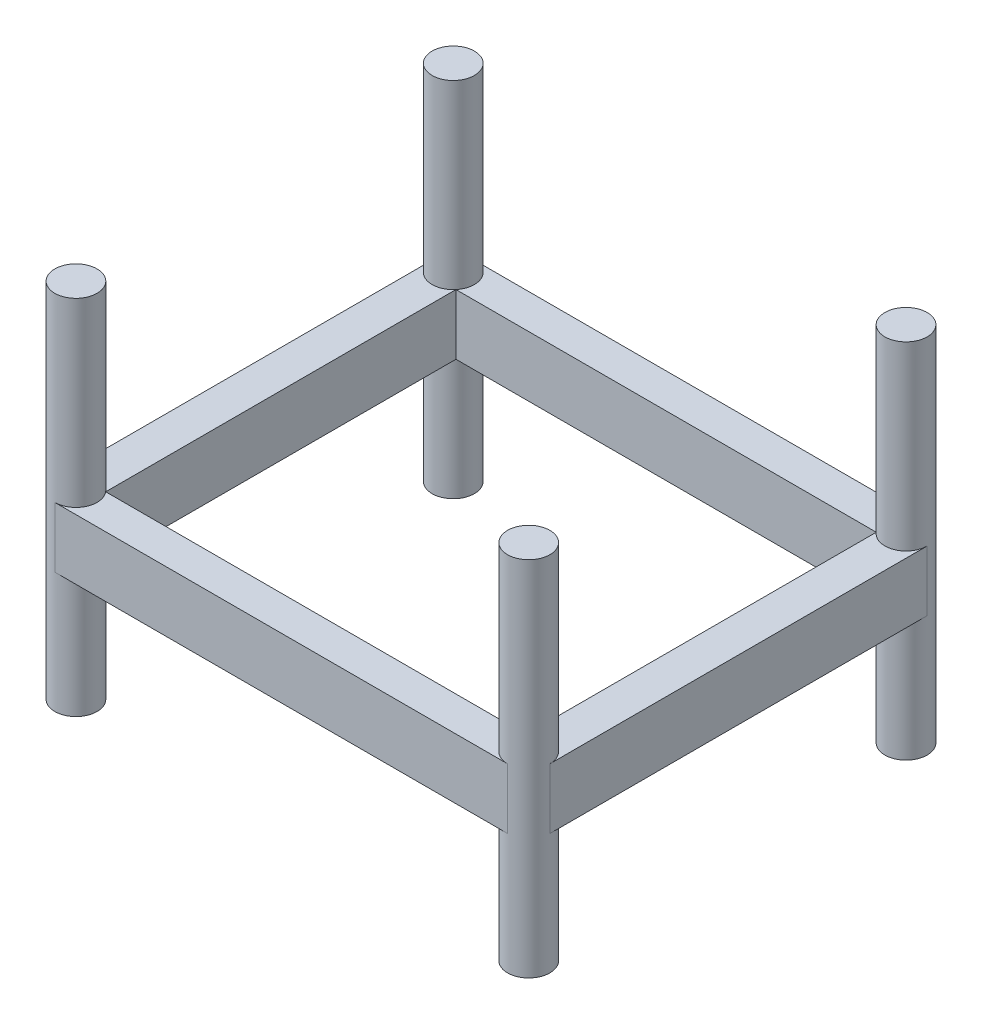
ISO-10303-21;
HEADER;
FILE_DESCRIPTION(('STEP AP214'),'2;1');
FILE_NAME('part.step','',(''),(''),'','','');
FILE_SCHEMA(('AUTOMOTIVE_DESIGN { 1 0 10303 214 1 1 1 1 }'));
ENDSEC;
DATA;
#1=APPLICATION_CONTEXT('core data for automotive mechanical design processes');
#2=APPLICATION_PROTOCOL_DEFINITION('international standard','automotive_design',2000,#1);
#3=PRODUCT_CONTEXT('',#1,'mechanical');
#4=PRODUCT('Part','Part','',(#3));
#5=PRODUCT_RELATED_PRODUCT_CATEGORY('part','',(#4));
#6=PRODUCT_DEFINITION_FORMATION('','',#4);
#7=PRODUCT_DEFINITION_CONTEXT('part definition',#1,'design');
#8=PRODUCT_DEFINITION('design','',#6,#7);
#9=PRODUCT_DEFINITION_SHAPE('','',#8);
#10=(LENGTH_UNIT() NAMED_UNIT(*) SI_UNIT(.MILLI.,.METRE.));
#11=(NAMED_UNIT(*) PLANE_ANGLE_UNIT() SI_UNIT($,.RADIAN.));
#12=(NAMED_UNIT(*) SI_UNIT($,.STERADIAN.) SOLID_ANGLE_UNIT());
#13=UNCERTAINTY_MEASURE_WITH_UNIT(LENGTH_MEASURE(1.E-05),#10,'distance_accuracy_value','');
#14=(GEOMETRIC_REPRESENTATION_CONTEXT(3) GLOBAL_UNCERTAINTY_ASSIGNED_CONTEXT((#13)) GLOBAL_UNIT_ASSIGNED_CONTEXT((#10,
#11,#12)) REPRESENTATION_CONTEXT('',''));
#15=CARTESIAN_POINT('',(0.,0.,0.));
#16=DIRECTION('',(0.,0.,1.));
#17=DIRECTION('',(1.,0.,0.));
#18=AXIS2_PLACEMENT_3D('',#15,#16,#17);
#19=CARTESIAN_POINT('',(-19.05,5.08,15.875));
#20=DIRECTION('',(0.,1.,0.));
#21=DIRECTION('',(0.,0.,1.));
#22=AXIS2_PLACEMENT_3D('',#19,#20,#21);
#23=PLANE('',#22);
#24=CARTESIAN_POINT('',(-19.05,5.08,-15.875));
#25=DIRECTION('',(0.,1.,0.));
#26=DIRECTION('',(0.,0.,1.));
#27=AXIS2_PLACEMENT_3D('',#24,#25,#26);
#28=CIRCLE('',#27,1.778);
#29=CARTESIAN_POINT('',(-17.6841025648759,5.08,-14.7367521373966));
#30=VERTEX_POINT('',#29);
#31=CARTESIAN_POINT('',(-19.05,5.08,-17.653));
#32=VERTEX_POINT('',#31);
#33=EDGE_CURVE('E105',#30,#32,#28,.T.);
#34=ORIENTED_EDGE('',*,*,#33,.F.);
#35=DIRECTION('',(-1.,0.,0.));
#36=VECTOR('',#35,1.);
#37=CARTESIAN_POINT('',(-17.6841025648759,5.08,-14.7367521373966));
#38=LINE('',#37,#36);
#39=CARTESIAN_POINT('',(17.6841025648759,5.08,-14.7367521373966));
#40=VERTEX_POINT('',#39);
#41=EDGE_CURVE('E191',#40,#30,#38,.T.);
#42=ORIENTED_EDGE('',*,*,#41,.F.);
#43=CARTESIAN_POINT('',(19.05,5.08,-15.875));
#44=DIRECTION('',(0.,1.,0.));
#45=DIRECTION('',(0.,0.,1.));
#46=AXIS2_PLACEMENT_3D('',#43,#44,#45);
#47=CIRCLE('',#46,1.778);
#48=CARTESIAN_POINT('',(19.05,5.08,-17.653));
#49=VERTEX_POINT('',#48);
#50=EDGE_CURVE('E108',#49,#40,#47,.T.);
#51=ORIENTED_EDGE('',*,*,#50,.F.);
#52=DIRECTION('',(-1.,0.,0.));
#53=VECTOR('',#52,1.);
#54=CARTESIAN_POINT('',(-19.05,5.08,-17.653));
#55=LINE('',#54,#53);
#56=EDGE_CURVE('E100',#49,#32,#55,.T.);
#57=ORIENTED_EDGE('',*,*,#56,.T.);
#58=EDGE_LOOP('',(#34,#42,#51,#57));
#59=FACE_BOUND('',#58,.T.);
#60=ADVANCED_FACE('F39',(#59),#23,.T.);
#61=CARTESIAN_POINT('',(-19.05,0.,15.875));
#62=DIRECTION('',(0.,1.,0.));
#63=DIRECTION('',(0.,0.,1.));
#64=AXIS2_PLACEMENT_3D('',#61,#62,#63);
#65=PLANE('',#64);
#66=DIRECTION('',(-1.,0.,0.));
#67=VECTOR('',#66,1.);
#68=CARTESIAN_POINT('',(-17.6841025648759,0.,-14.7367521373966));
#69=LINE('',#68,#67);
#70=CARTESIAN_POINT('',(17.6841025648759,0.,-14.7367521373966));
#71=VERTEX_POINT('',#70);
#72=CARTESIAN_POINT('',(-17.6841025648759,0.,-14.7367521373966));
#73=VERTEX_POINT('',#72);
#74=EDGE_CURVE('E208',#71,#73,#69,.T.);
#75=ORIENTED_EDGE('',*,*,#74,.T.);
#76=CARTESIAN_POINT('',(-19.05,0.,-15.875));
#77=DIRECTION('',(0.,1.,0.));
#78=DIRECTION('',(0.,0.,1.));
#79=AXIS2_PLACEMENT_3D('',#76,#77,#78);
#80=CIRCLE('',#79,1.778);
#81=CARTESIAN_POINT('',(-19.05,0.,-17.653));
#82=VERTEX_POINT('',#81);
#83=EDGE_CURVE('E140',#73,#82,#80,.T.);
#84=ORIENTED_EDGE('',*,*,#83,.T.);
#85=DIRECTION('',(-1.,0.,0.));
#86=VECTOR('',#85,1.);
#87=CARTESIAN_POINT('',(-19.05,0.,-17.653));
#88=LINE('',#87,#86);
#89=CARTESIAN_POINT('',(19.05,0.,-17.653));
#90=VERTEX_POINT('',#89);
#91=EDGE_CURVE('E121',#90,#82,#88,.T.);
#92=ORIENTED_EDGE('',*,*,#91,.F.);
#93=CARTESIAN_POINT('',(19.05,0.,-15.875));
#94=DIRECTION('',(0.,1.,0.));
#95=DIRECTION('',(0.,0.,1.));
#96=AXIS2_PLACEMENT_3D('',#93,#94,#95);
#97=CIRCLE('',#96,1.778);
#98=EDGE_CURVE('E151',#90,#71,#97,.T.);
#99=ORIENTED_EDGE('',*,*,#98,.T.);
#100=EDGE_LOOP('',(#75,#84,#92,#99));
#101=FACE_BOUND('',#100,.T.);
#102=ADVANCED_FACE('F357',(#101),#65,.F.);
#103=CARTESIAN_POINT('',(-20.828,5.08,-15.875));
#104=VERTEX_POINT('',#103);
#105=EDGE_CURVE('E131',#104,#30,#28,.T.);
#106=ORIENTED_EDGE('',*,*,#105,.F.);
#107=DIRECTION('',(0.,0.,1.));
#108=VECTOR('',#107,1.);
#109=CARTESIAN_POINT('',(-20.828,5.08,15.875));
#110=LINE('',#109,#108);
#111=CARTESIAN_POINT('',(-20.828,5.08,15.875));
#112=VERTEX_POINT('',#111);
#113=EDGE_CURVE('E61',#104,#112,#110,.T.);
#114=ORIENTED_EDGE('',*,*,#113,.T.);
#115=CARTESIAN_POINT('',(-19.05,5.08,15.875));
#116=DIRECTION('',(0.,1.,0.));
#117=DIRECTION('',(0.,0.,1.));
#118=AXIS2_PLACEMENT_3D('',#115,#116,#117);
#119=CIRCLE('',#118,1.778);
#120=CARTESIAN_POINT('',(-17.6841025648759,5.08,14.7367521373966));
#121=VERTEX_POINT('',#120);
#122=EDGE_CURVE('E55',#121,#112,#119,.T.);
#123=ORIENTED_EDGE('',*,*,#122,.F.);
#124=DIRECTION('',(0.,0.,1.));
#125=VECTOR('',#124,1.);
#126=CARTESIAN_POINT('',(-17.6841025648759,5.08,14.7367521373966));
#127=LINE('',#126,#125);
#128=EDGE_CURVE('E196',#30,#121,#127,.T.);
#129=ORIENTED_EDGE('',*,*,#128,.F.);
#130=EDGE_LOOP('',(#106,#114,#123,#129));
#131=FACE_BOUND('',#130,.T.);
#132=ADVANCED_FACE('F370',(#131),#23,.T.);
#133=DIRECTION('',(0.,0.,1.));
#134=VECTOR('',#133,1.);
#135=CARTESIAN_POINT('',(-20.828,0.,15.875));
#136=LINE('',#135,#134);
#137=CARTESIAN_POINT('',(-20.828,0.,-15.875));
#138=VERTEX_POINT('',#137);
#139=CARTESIAN_POINT('',(-20.828,0.,15.875));
#140=VERTEX_POINT('',#139);
#141=EDGE_CURVE('E239',#138,#140,#136,.T.);
#142=ORIENTED_EDGE('',*,*,#141,.F.);
#143=EDGE_CURVE('E142',#138,#73,#80,.T.);
#144=ORIENTED_EDGE('',*,*,#143,.T.);
#145=DIRECTION('',(0.,0.,1.));
#146=VECTOR('',#145,1.);
#147=CARTESIAN_POINT('',(-17.6841025648759,0.,14.7367521373966));
#148=LINE('',#147,#146);
#149=CARTESIAN_POINT('',(-17.6841025648758,0.,14.7367521373966));
#150=VERTEX_POINT('',#149);
#151=EDGE_CURVE('E212',#73,#150,#148,.T.);
#152=ORIENTED_EDGE('',*,*,#151,.T.);
#153=CARTESIAN_POINT('',(-19.05,0.,15.875));
#154=DIRECTION('',(0.,1.,0.));
#155=DIRECTION('',(0.,0.,1.));
#156=AXIS2_PLACEMENT_3D('',#153,#154,#155);
#157=CIRCLE('',#156,1.778);
#158=EDGE_CURVE('E179',#150,#140,#157,.T.);
#159=ORIENTED_EDGE('',*,*,#158,.T.);
#160=EDGE_LOOP('',(#142,#144,#152,#159));
#161=FACE_BOUND('',#160,.T.);
#162=ADVANCED_FACE('F318',(#161),#65,.F.);
#163=CARTESIAN_POINT('',(20.828,5.08,-15.875));
#164=VERTEX_POINT('',#163);
#165=EDGE_CURVE('E150',#40,#164,#47,.T.);
#166=ORIENTED_EDGE('',*,*,#165,.F.);
#167=DIRECTION('',(0.,0.,-1.));
#168=VECTOR('',#167,1.);
#169=CARTESIAN_POINT('',(17.6841025648759,5.08,-14.7367521373966));
#170=LINE('',#169,#168);
#171=CARTESIAN_POINT('',(17.6841025648759,5.08,14.7367521373966));
#172=VERTEX_POINT('',#171);
#173=EDGE_CURVE('E187',#172,#40,#170,.T.);
#174=ORIENTED_EDGE('',*,*,#173,.F.);
#175=CARTESIAN_POINT('',(19.05,5.08,15.875));
#176=DIRECTION('',(0.,1.,0.));
#177=DIRECTION('',(0.,0.,1.));
#178=AXIS2_PLACEMENT_3D('',#175,#176,#177);
#179=CIRCLE('',#178,1.778);
#180=CARTESIAN_POINT('',(20.828,5.08,15.875));
#181=VERTEX_POINT('',#180);
#182=EDGE_CURVE('E89',#181,#172,#179,.T.);
#183=ORIENTED_EDGE('',*,*,#182,.F.);
#184=DIRECTION('',(0.,0.,-1.));
#185=VECTOR('',#184,1.);
#186=CARTESIAN_POINT('',(20.828,5.08,-15.875));
#187=LINE('',#186,#185);
#188=EDGE_CURVE('E113',#181,#164,#187,.T.);
#189=ORIENTED_EDGE('',*,*,#188,.T.);
#190=EDGE_LOOP('',(#166,#174,#183,#189));
#191=FACE_BOUND('',#190,.T.);
#192=ADVANCED_FACE('F345',(#191),#23,.T.);
#193=DIRECTION('',(0.,0.,-1.));
#194=VECTOR('',#193,1.);
#195=CARTESIAN_POINT('',(17.6841025648759,0.,-14.7367521373966));
#196=LINE('',#195,#194);
#197=CARTESIAN_POINT('',(17.6841025648759,0.,14.7367521373966));
#198=VERTEX_POINT('',#197);
#199=EDGE_CURVE('E205',#198,#71,#196,.T.);
#200=ORIENTED_EDGE('',*,*,#199,.T.);
#201=CARTESIAN_POINT('',(20.828,0.,-15.875));
#202=VERTEX_POINT('',#201);
#203=EDGE_CURVE('E80',#71,#202,#97,.T.);
#204=ORIENTED_EDGE('',*,*,#203,.T.);
#205=DIRECTION('',(0.,0.,-1.));
#206=VECTOR('',#205,1.);
#207=CARTESIAN_POINT('',(20.828,0.,-15.875));
#208=LINE('',#207,#206);
#209=CARTESIAN_POINT('',(20.828,0.,15.875));
#210=VERTEX_POINT('',#209);
#211=EDGE_CURVE('E248',#210,#202,#208,.T.);
#212=ORIENTED_EDGE('',*,*,#211,.F.);
#213=CARTESIAN_POINT('',(19.05,0.,15.875));
#214=DIRECTION('',(0.,1.,0.));
#215=DIRECTION('',(0.,0.,1.));
#216=AXIS2_PLACEMENT_3D('',#213,#214,#215);
#217=CIRCLE('',#216,1.778);
#218=EDGE_CURVE('E167',#210,#198,#217,.T.);
#219=ORIENTED_EDGE('',*,*,#218,.T.);
#220=EDGE_LOOP('',(#200,#204,#212,#219));
#221=FACE_BOUND('',#220,.T.);
#222=ADVANCED_FACE('F360',(#221),#65,.F.);
#223=CARTESIAN_POINT('',(19.05,5.08,17.653));
#224=VERTEX_POINT('',#223);
#225=EDGE_CURVE('E166',#172,#224,#179,.T.);
#226=ORIENTED_EDGE('',*,*,#225,.F.);
#227=DIRECTION('',(1.,0.,0.));
#228=VECTOR('',#227,1.);
#229=CARTESIAN_POINT('',(-17.6841025648759,5.08,14.7367521373966));
#230=LINE('',#229,#228);
#231=EDGE_CURVE('E200',#121,#172,#230,.T.);
#232=ORIENTED_EDGE('',*,*,#231,.F.);
#233=CARTESIAN_POINT('',(-19.05,5.08,17.653));
#234=VERTEX_POINT('',#233);
#235=EDGE_CURVE('E186',#234,#121,#119,.T.);
#236=ORIENTED_EDGE('',*,*,#235,.F.);
#237=DIRECTION('',(1.,0.,0.));
#238=VECTOR('',#237,1.);
#239=CARTESIAN_POINT('',(-19.05,5.08,17.653));
#240=LINE('',#239,#238);
#241=EDGE_CURVE('E235',#234,#224,#240,.T.);
#242=ORIENTED_EDGE('',*,*,#241,.T.);
#243=EDGE_LOOP('',(#226,#232,#236,#242));
#244=FACE_BOUND('',#243,.T.);
#245=ADVANCED_FACE('F293',(#244),#23,.T.);
#246=DIRECTION('',(1.,0.,0.));
#247=VECTOR('',#246,1.);
#248=CARTESIAN_POINT('',(-17.6841025648759,0.,14.7367521373966));
#249=LINE('',#248,#247);
#250=EDGE_CURVE('E192',#150,#198,#249,.T.);
#251=ORIENTED_EDGE('',*,*,#250,.T.);
#252=CARTESIAN_POINT('',(19.05,0.,17.653));
#253=VERTEX_POINT('',#252);
#254=EDGE_CURVE('E163',#198,#253,#217,.T.);
#255=ORIENTED_EDGE('',*,*,#254,.T.);
#256=DIRECTION('',(1.,0.,0.));
#257=VECTOR('',#256,1.);
#258=CARTESIAN_POINT('',(-19.05,0.,17.653));
#259=LINE('',#258,#257);
#260=CARTESIAN_POINT('',(-19.05,0.,17.653));
#261=VERTEX_POINT('',#260);
#262=EDGE_CURVE('E234',#261,#253,#259,.T.);
#263=ORIENTED_EDGE('',*,*,#262,.F.);
#264=EDGE_CURVE('E183',#261,#150,#157,.T.);
#265=ORIENTED_EDGE('',*,*,#264,.T.);
#266=EDGE_LOOP('',(#251,#255,#263,#265));
#267=FACE_BOUND('',#266,.T.);
#268=ADVANCED_FACE('F304',(#267),#65,.F.);
#269=CARTESIAN_POINT('',(-19.05,5.08,15.875));
#270=DIRECTION('',(0.,-1.,0.));
#271=DIRECTION('',(0.,0.,-1.));
#272=AXIS2_PLACEMENT_3D('',#269,#270,#271);
#273=CYLINDRICAL_SURFACE('',#272,1.778);
#274=DIRECTION('',(0.,-1.,0.));
#275=VECTOR('',#274,1.);
#276=CARTESIAN_POINT('',(-20.828,5.08,15.875));
#277=LINE('',#276,#275);
#278=EDGE_CURVE('E244',#112,#140,#277,.T.);
#279=ORIENTED_EDGE('',*,*,#278,.T.);
#280=ORIENTED_EDGE('',*,*,#158,.F.);
#281=ORIENTED_EDGE('',*,*,#264,.F.);
#282=DIRECTION('',(0.,-1.,0.));
#283=VECTOR('',#282,1.);
#284=CARTESIAN_POINT('',(-19.05,5.08,17.653));
#285=LINE('',#284,#283);
#286=EDGE_CURVE('E11',#234,#261,#285,.T.);
#287=ORIENTED_EDGE('',*,*,#286,.F.);
#288=ORIENTED_EDGE('',*,*,#235,.T.);
#289=ORIENTED_EDGE('',*,*,#122,.T.);
#290=EDGE_LOOP('',(#279,#280,#281,#287,#288,#289));
#291=FACE_BOUND('',#290,.T.);
#292=CARTESIAN_POINT('',(-19.05,-10.16,15.875));
#293=DIRECTION('',(0.,1.,0.));
#294=DIRECTION('',(0.,0.,1.));
#295=AXIS2_PLACEMENT_3D('',#292,#293,#294);
#296=CIRCLE('',#295,1.778);
#297=CARTESIAN_POINT('',(-19.05,-10.16,17.653));
#298=VERTEX_POINT('',#297);
#299=EDGE_CURVE('E175',#298,#298,#296,.T.);
#300=ORIENTED_EDGE('',*,*,#299,.T.);
#301=EDGE_LOOP('',(#300));
#302=FACE_BOUND('',#301,.T.);
#303=CARTESIAN_POINT('',(-19.05,20.32,15.875));
#304=DIRECTION('',(0.,1.,0.));
#305=DIRECTION('',(0.,0.,1.));
#306=AXIS2_PLACEMENT_3D('',#303,#304,#305);
#307=CIRCLE('',#306,1.778);
#308=CARTESIAN_POINT('',(-19.05,20.32,17.653));
#309=VERTEX_POINT('',#308);
#310=EDGE_CURVE('E171',#309,#309,#307,.T.);
#311=ORIENTED_EDGE('',*,*,#310,.F.);
#312=EDGE_LOOP('',(#311));
#313=FACE_BOUND('',#312,.T.);
#314=ADVANCED_FACE('F41',(#291,#302,#313),#273,.T.);
#315=CARTESIAN_POINT('',(-19.05,5.08,17.653));
#316=DIRECTION('',(0.,0.,-1.));
#317=DIRECTION('',(-1.,0.,0.));
#318=AXIS2_PLACEMENT_3D('',#315,#316,#317);
#319=PLANE('',#318);
#320=ORIENTED_EDGE('',*,*,#262,.T.);
#321=DIRECTION('',(0.,-1.,0.));
#322=VECTOR('',#321,1.);
#323=CARTESIAN_POINT('',(19.05,5.08,17.653));
#324=LINE('',#323,#322);
#325=EDGE_CURVE('E48',#224,#253,#324,.T.);
#326=ORIENTED_EDGE('',*,*,#325,.F.);
#327=ORIENTED_EDGE('',*,*,#241,.F.);
#328=ORIENTED_EDGE('',*,*,#286,.T.);
#329=EDGE_LOOP('',(#320,#326,#327,#328));
#330=FACE_BOUND('',#329,.T.);
#331=ADVANCED_FACE('F285',(#330),#319,.F.);
#332=CARTESIAN_POINT('',(19.05,5.08,15.875));
#333=DIRECTION('',(0.,-1.,0.));
#334=DIRECTION('',(0.,0.,-1.));
#335=AXIS2_PLACEMENT_3D('',#332,#333,#334);
#336=CYLINDRICAL_SURFACE('',#335,1.778);
#337=ORIENTED_EDGE('',*,*,#325,.T.);
#338=ORIENTED_EDGE('',*,*,#254,.F.);
#339=ORIENTED_EDGE('',*,*,#218,.F.);
#340=DIRECTION('',(0.,-1.,0.));
#341=VECTOR('',#340,1.);
#342=CARTESIAN_POINT('',(20.828,5.08,15.875));
#343=LINE('',#342,#341);
#344=EDGE_CURVE('E268',#181,#210,#343,.T.);
#345=ORIENTED_EDGE('',*,*,#344,.F.);
#346=ORIENTED_EDGE('',*,*,#182,.T.);
#347=ORIENTED_EDGE('',*,*,#225,.T.);
#348=EDGE_LOOP('',(#337,#338,#339,#345,#346,#347));
#349=FACE_BOUND('',#348,.T.);
#350=CARTESIAN_POINT('',(19.05,-10.16,15.875));
#351=DIRECTION('',(0.,1.,0.));
#352=DIRECTION('',(0.,0.,1.));
#353=AXIS2_PLACEMENT_3D('',#350,#351,#352);
#354=CIRCLE('',#353,1.778);
#355=CARTESIAN_POINT('',(19.05,-10.16,17.653));
#356=VERTEX_POINT('',#355);
#357=EDGE_CURVE('E159',#356,#356,#354,.T.);
#358=ORIENTED_EDGE('',*,*,#357,.T.);
#359=EDGE_LOOP('',(#358));
#360=FACE_BOUND('',#359,.T.);
#361=CARTESIAN_POINT('',(19.05,20.32,15.875));
#362=DIRECTION('',(0.,1.,0.));
#363=DIRECTION('',(0.,0.,1.));
#364=AXIS2_PLACEMENT_3D('',#361,#362,#363);
#365=CIRCLE('',#364,1.778);
#366=CARTESIAN_POINT('',(19.05,20.32,17.653));
#367=VERTEX_POINT('',#366);
#368=EDGE_CURVE('E155',#367,#367,#365,.T.);
#369=ORIENTED_EDGE('',*,*,#368,.F.);
#370=EDGE_LOOP('',(#369));
#371=FACE_BOUND('',#370,.T.);
#372=ADVANCED_FACE('F276',(#349,#360,#371),#336,.T.);
#373=CARTESIAN_POINT('',(20.828,5.08,-15.875));
#374=DIRECTION('',(-1.,0.,0.));
#375=DIRECTION('',(0.,0.,1.));
#376=AXIS2_PLACEMENT_3D('',#373,#374,#375);
#377=PLANE('',#376);
#378=ORIENTED_EDGE('',*,*,#211,.T.);
#379=DIRECTION('',(0.,-1.,0.));
#380=VECTOR('',#379,1.);
#381=CARTESIAN_POINT('',(20.828,5.08,-15.875));
#382=LINE('',#381,#380);
#383=EDGE_CURVE('E264',#164,#202,#382,.T.);
#384=ORIENTED_EDGE('',*,*,#383,.F.);
#385=ORIENTED_EDGE('',*,*,#188,.F.);
#386=ORIENTED_EDGE('',*,*,#344,.T.);
#387=EDGE_LOOP('',(#378,#384,#385,#386));
#388=FACE_BOUND('',#387,.T.);
#389=ADVANCED_FACE('F359',(#388),#377,.F.);
#390=CARTESIAN_POINT('',(19.05,5.08,-15.875));
#391=DIRECTION('',(0.,-1.,0.));
#392=DIRECTION('',(0.,0.,-1.));
#393=AXIS2_PLACEMENT_3D('',#390,#391,#392);
#394=CYLINDRICAL_SURFACE('',#393,1.778);
#395=ORIENTED_EDGE('',*,*,#383,.T.);
#396=ORIENTED_EDGE('',*,*,#203,.F.);
#397=ORIENTED_EDGE('',*,*,#98,.F.);
#398=DIRECTION('',(0.,-1.,0.));
#399=VECTOR('',#398,1.);
#400=CARTESIAN_POINT('',(19.05,5.08,-17.653));
#401=LINE('',#400,#399);
#402=EDGE_CURVE('E125',#49,#90,#401,.T.);
#403=ORIENTED_EDGE('',*,*,#402,.F.);
#404=ORIENTED_EDGE('',*,*,#50,.T.);
#405=ORIENTED_EDGE('',*,*,#165,.T.);
#406=EDGE_LOOP('',(#395,#396,#397,#403,#404,#405));
#407=FACE_BOUND('',#406,.T.);
#408=CARTESIAN_POINT('',(19.05,-10.16,-15.875));
#409=DIRECTION('',(0.,1.,0.));
#410=DIRECTION('',(0.,0.,1.));
#411=AXIS2_PLACEMENT_3D('',#408,#409,#410);
#412=CIRCLE('',#411,1.778);
#413=CARTESIAN_POINT('',(19.05,-10.16,-14.097));
#414=VERTEX_POINT('',#413);
#415=EDGE_CURVE('E138',#414,#414,#412,.T.);
#416=ORIENTED_EDGE('',*,*,#415,.T.);
#417=EDGE_LOOP('',(#416));
#418=FACE_BOUND('',#417,.T.);
#419=CARTESIAN_POINT('',(19.05,20.32,-15.875));
#420=DIRECTION('',(0.,1.,0.));
#421=DIRECTION('',(0.,0.,1.));
#422=AXIS2_PLACEMENT_3D('',#419,#420,#421);
#423=CIRCLE('',#422,1.778);
#424=CARTESIAN_POINT('',(19.05,20.32,-14.097));
#425=VERTEX_POINT('',#424);
#426=EDGE_CURVE('E133',#425,#425,#423,.T.);
#427=ORIENTED_EDGE('',*,*,#426,.F.);
#428=EDGE_LOOP('',(#427));
#429=FACE_BOUND('',#428,.T.);
#430=ADVANCED_FACE('F351',(#407,#418,#429),#394,.T.);
#431=CARTESIAN_POINT('',(-19.05,5.08,-17.653));
#432=DIRECTION('',(0.,0.,1.));
#433=DIRECTION('',(1.,0.,0.));
#434=AXIS2_PLACEMENT_3D('',#431,#432,#433);
#435=PLANE('',#434);
#436=ORIENTED_EDGE('',*,*,#91,.T.);
#437=DIRECTION('',(0.,-1.,0.));
#438=VECTOR('',#437,1.);
#439=CARTESIAN_POINT('',(-19.05,5.08,-17.653));
#440=LINE('',#439,#438);
#441=EDGE_CURVE('E117',#32,#82,#440,.T.);
#442=ORIENTED_EDGE('',*,*,#441,.F.);
#443=ORIENTED_EDGE('',*,*,#56,.F.);
#444=ORIENTED_EDGE('',*,*,#402,.T.);
#445=EDGE_LOOP('',(#436,#442,#443,#444));
#446=FACE_BOUND('',#445,.T.);
#447=ADVANCED_FACE('F118',(#446),#435,.F.);
#448=CARTESIAN_POINT('',(-19.05,5.08,-15.875));
#449=DIRECTION('',(0.,-1.,0.));
#450=DIRECTION('',(0.,0.,-1.));
#451=AXIS2_PLACEMENT_3D('',#448,#449,#450);
#452=CYLINDRICAL_SURFACE('',#451,1.778);
#453=ORIENTED_EDGE('',*,*,#441,.T.);
#454=ORIENTED_EDGE('',*,*,#83,.F.);
#455=ORIENTED_EDGE('',*,*,#143,.F.);
#456=DIRECTION('',(0.,-1.,0.));
#457=VECTOR('',#456,1.);
#458=CARTESIAN_POINT('',(-20.828,5.08,-15.875));
#459=LINE('',#458,#457);
#460=EDGE_CURVE('E126',#104,#138,#459,.T.);
#461=ORIENTED_EDGE('',*,*,#460,.F.);
#462=ORIENTED_EDGE('',*,*,#105,.T.);
#463=ORIENTED_EDGE('',*,*,#33,.T.);
#464=EDGE_LOOP('',(#453,#454,#455,#461,#462,#463));
#465=FACE_BOUND('',#464,.T.);
#466=CARTESIAN_POINT('',(-19.05,-10.16,-15.875));
#467=DIRECTION('',(0.,1.,0.));
#468=DIRECTION('',(0.,0.,1.));
#469=AXIS2_PLACEMENT_3D('',#466,#467,#468);
#470=CIRCLE('',#469,1.778);
#471=CARTESIAN_POINT('',(-19.05,-10.16,-14.097));
#472=VERTEX_POINT('',#471);
#473=EDGE_CURVE('E323',#472,#472,#470,.T.);
#474=ORIENTED_EDGE('',*,*,#473,.T.);
#475=EDGE_LOOP('',(#474));
#476=FACE_BOUND('',#475,.T.);
#477=CARTESIAN_POINT('',(-19.05,20.32,-15.875));
#478=DIRECTION('',(0.,1.,0.));
#479=DIRECTION('',(0.,0.,1.));
#480=AXIS2_PLACEMENT_3D('',#477,#478,#479);
#481=CIRCLE('',#480,1.778);
#482=CARTESIAN_POINT('',(-19.05,20.32,-14.097));
#483=VERTEX_POINT('',#482);
#484=EDGE_CURVE('E550',#483,#483,#481,.T.);
#485=ORIENTED_EDGE('',*,*,#484,.F.);
#486=EDGE_LOOP('',(#485));
#487=FACE_BOUND('',#486,.T.);
#488=ADVANCED_FACE('F128',(#465,#476,#487),#452,.T.);
#489=CARTESIAN_POINT('',(-20.828,5.08,15.875));
#490=DIRECTION('',(1.,0.,0.));
#491=DIRECTION('',(0.,0.,-1.));
#492=AXIS2_PLACEMENT_3D('',#489,#490,#491);
#493=PLANE('',#492);
#494=ORIENTED_EDGE('',*,*,#141,.T.);
#495=ORIENTED_EDGE('',*,*,#278,.F.);
#496=ORIENTED_EDGE('',*,*,#113,.F.);
#497=ORIENTED_EDGE('',*,*,#460,.T.);
#498=EDGE_LOOP('',(#494,#495,#496,#497));
#499=FACE_BOUND('',#498,.T.);
#500=ADVANCED_FACE('F383',(#499),#493,.F.);
#501=CARTESIAN_POINT('',(17.6841025648759,5.08,-14.7367521373966));
#502=DIRECTION('',(-1.,0.,0.));
#503=DIRECTION('',(0.,0.,1.));
#504=AXIS2_PLACEMENT_3D('',#501,#502,#503);
#505=PLANE('',#504);
#506=ORIENTED_EDGE('',*,*,#199,.F.);
#507=DIRECTION('',(0.,-1.,0.));
#508=VECTOR('',#507,1.);
#509=CARTESIAN_POINT('',(17.6841025648759,5.08,14.7367521373966));
#510=LINE('',#509,#508);
#511=EDGE_CURVE('E204',#172,#198,#510,.T.);
#512=ORIENTED_EDGE('',*,*,#511,.F.);
#513=ORIENTED_EDGE('',*,*,#173,.T.);
#514=DIRECTION('',(0.,-1.,0.));
#515=VECTOR('',#514,1.);
#516=CARTESIAN_POINT('',(17.6841025648759,5.08,-14.7367521373966));
#517=LINE('',#516,#515);
#518=EDGE_CURVE('E230',#40,#71,#517,.T.);
#519=ORIENTED_EDGE('',*,*,#518,.T.);
#520=EDGE_LOOP('',(#506,#512,#513,#519));
#521=FACE_BOUND('',#520,.T.);
#522=ADVANCED_FACE('F350',(#521),#505,.T.);
#523=CARTESIAN_POINT('',(-17.6841025648759,5.08,-14.7367521373966));
#524=DIRECTION('',(0.,0.,1.));
#525=DIRECTION('',(1.,0.,0.));
#526=AXIS2_PLACEMENT_3D('',#523,#524,#525);
#527=PLANE('',#526);
#528=ORIENTED_EDGE('',*,*,#74,.F.);
#529=ORIENTED_EDGE('',*,*,#518,.F.);
#530=ORIENTED_EDGE('',*,*,#41,.T.);
#531=DIRECTION('',(0.,-1.,0.));
#532=VECTOR('',#531,1.);
#533=CARTESIAN_POINT('',(-17.6841025648759,5.08,-14.7367521373966));
#534=LINE('',#533,#532);
#535=EDGE_CURVE('E226',#30,#73,#534,.T.);
#536=ORIENTED_EDGE('',*,*,#535,.T.);
#537=EDGE_LOOP('',(#528,#529,#530,#536));
#538=FACE_BOUND('',#537,.T.);
#539=ADVANCED_FACE('F326',(#538),#527,.T.);
#540=CARTESIAN_POINT('',(-17.6841025648759,5.08,14.7367521373966));
#541=DIRECTION('',(1.,0.,0.));
#542=DIRECTION('',(0.,0.,-1.));
#543=AXIS2_PLACEMENT_3D('',#540,#541,#542);
#544=PLANE('',#543);
#545=ORIENTED_EDGE('',*,*,#151,.F.);
#546=ORIENTED_EDGE('',*,*,#535,.F.);
#547=ORIENTED_EDGE('',*,*,#128,.T.);
#548=DIRECTION('',(0.,-1.,0.));
#549=VECTOR('',#548,1.);
#550=CARTESIAN_POINT('',(-17.6841025648759,5.08,14.7367521373966));
#551=LINE('',#550,#549);
#552=EDGE_CURVE('E222',#121,#150,#551,.T.);
#553=ORIENTED_EDGE('',*,*,#552,.T.);
#554=EDGE_LOOP('',(#545,#546,#547,#553));
#555=FACE_BOUND('',#554,.T.);
#556=ADVANCED_FACE('F310',(#555),#544,.T.);
#557=CARTESIAN_POINT('',(-17.6841025648759,5.08,14.7367521373966));
#558=DIRECTION('',(0.,0.,-1.));
#559=DIRECTION('',(-1.,0.,0.));
#560=AXIS2_PLACEMENT_3D('',#557,#558,#559);
#561=PLANE('',#560);
#562=ORIENTED_EDGE('',*,*,#250,.F.);
#563=ORIENTED_EDGE('',*,*,#552,.F.);
#564=ORIENTED_EDGE('',*,*,#231,.T.);
#565=ORIENTED_EDGE('',*,*,#511,.T.);
#566=EDGE_LOOP('',(#562,#563,#564,#565));
#567=FACE_BOUND('',#566,.T.);
#568=ADVANCED_FACE('F313',(#567),#561,.T.);
#569=CARTESIAN_POINT('',(-19.05,-10.16,15.875));
#570=DIRECTION('',(0.,1.,0.));
#571=DIRECTION('',(0.,0.,1.));
#572=AXIS2_PLACEMENT_3D('',#569,#570,#571);
#573=PLANE('',#572);
#574=ORIENTED_EDGE('',*,*,#299,.F.);
#575=EDGE_LOOP('',(#574));
#576=FACE_BOUND('',#575,.T.);
#577=ADVANCED_FACE('F393',(#576),#573,.F.);
#578=CARTESIAN_POINT('',(-19.05,20.32,15.875));
#579=DIRECTION('',(0.,1.,0.));
#580=DIRECTION('',(0.,0.,1.));
#581=AXIS2_PLACEMENT_3D('',#578,#579,#580);
#582=PLANE('',#581);
#583=ORIENTED_EDGE('',*,*,#310,.T.);
#584=EDGE_LOOP('',(#583));
#585=FACE_BOUND('',#584,.T.);
#586=ADVANCED_FACE('F390',(#585),#582,.T.);
#587=CARTESIAN_POINT('',(19.05,-10.16,15.875));
#588=DIRECTION('',(0.,1.,0.));
#589=DIRECTION('',(0.,0.,1.));
#590=AXIS2_PLACEMENT_3D('',#587,#588,#589);
#591=PLANE('',#590);
#592=ORIENTED_EDGE('',*,*,#357,.F.);
#593=EDGE_LOOP('',(#592));
#594=FACE_BOUND('',#593,.T.);
#595=ADVANCED_FACE('F392',(#594),#591,.F.);
#596=CARTESIAN_POINT('',(19.05,20.32,15.875));
#597=DIRECTION('',(0.,1.,0.));
#598=DIRECTION('',(0.,0.,1.));
#599=AXIS2_PLACEMENT_3D('',#596,#597,#598);
#600=PLANE('',#599);
#601=ORIENTED_EDGE('',*,*,#368,.T.);
#602=EDGE_LOOP('',(#601));
#603=FACE_BOUND('',#602,.T.);
#604=ADVANCED_FACE('F399',(#603),#600,.T.);
#605=CARTESIAN_POINT('',(19.05,-10.16,-15.875));
#606=DIRECTION('',(0.,1.,0.));
#607=DIRECTION('',(0.,0.,1.));
#608=AXIS2_PLACEMENT_3D('',#605,#606,#607);
#609=PLANE('',#608);
#610=ORIENTED_EDGE('',*,*,#415,.F.);
#611=EDGE_LOOP('',(#610));
#612=FACE_BOUND('',#611,.T.);
#613=ADVANCED_FACE('F505',(#612),#609,.F.);
#614=CARTESIAN_POINT('',(19.05,20.32,-15.875));
#615=DIRECTION('',(0.,1.,0.));
#616=DIRECTION('',(0.,0.,1.));
#617=AXIS2_PLACEMENT_3D('',#614,#615,#616);
#618=PLANE('',#617);
#619=ORIENTED_EDGE('',*,*,#426,.T.);
#620=EDGE_LOOP('',(#619));
#621=FACE_BOUND('',#620,.T.);
#622=ADVANCED_FACE('F514',(#621),#618,.T.);
#623=CARTESIAN_POINT('',(-19.05,-10.16,-15.875));
#624=DIRECTION('',(0.,1.,0.));
#625=DIRECTION('',(0.,0.,1.));
#626=AXIS2_PLACEMENT_3D('',#623,#624,#625);
#627=PLANE('',#626);
#628=ORIENTED_EDGE('',*,*,#473,.F.);
#629=EDGE_LOOP('',(#628));
#630=FACE_BOUND('',#629,.T.);
#631=ADVANCED_FACE('F524',(#630),#627,.F.);
#632=CARTESIAN_POINT('',(-19.05,20.32,-15.875));
#633=DIRECTION('',(0.,1.,0.));
#634=DIRECTION('',(0.,0.,1.));
#635=AXIS2_PLACEMENT_3D('',#632,#633,#634);
#636=PLANE('',#635);
#637=ORIENTED_EDGE('',*,*,#484,.T.);
#638=EDGE_LOOP('',(#637));
#639=FACE_BOUND('',#638,.T.);
#640=ADVANCED_FACE('F534',(#639),#636,.T.);
#641=CLOSED_SHELL('',(#60,#102,#132,#162,#192,#222,#245,#268,#314,#331,#372,#389,#430,#447,#488,
#500,#522,#539,#556,#568,#577,#586,#595,#604,#613,#622,#631,#640));
#642=MANIFOLD_SOLID_BREP('B2',#641);
#643=ADVANCED_BREP_SHAPE_REPRESENTATION('',(#18,#642),#14);
#644=SHAPE_DEFINITION_REPRESENTATION(#9,#643);
ENDSEC;
END-ISO-10303-21;
